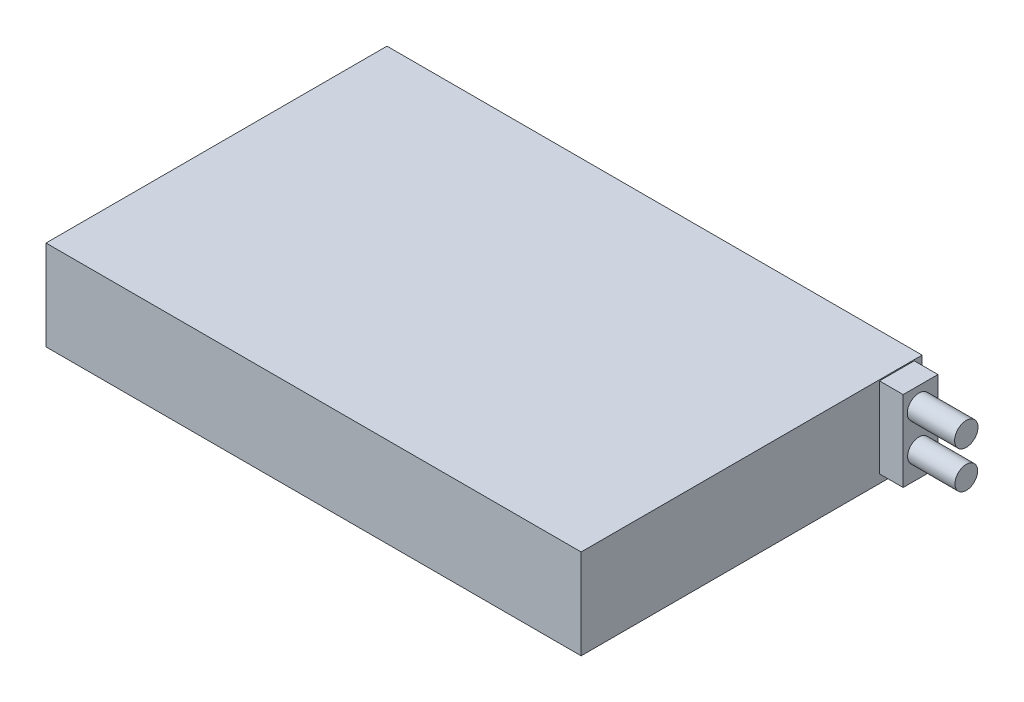
ISO-10303-21;
HEADER;
FILE_DESCRIPTION(('STEP AP214'),'2;1');
FILE_NAME('part.step','',(''),(''),'','','');
FILE_SCHEMA(('AUTOMOTIVE_DESIGN { 1 0 10303 214 1 1 1 1 }'));
ENDSEC;
DATA;
#1=APPLICATION_CONTEXT('core data for automotive mechanical design processes');
#2=APPLICATION_PROTOCOL_DEFINITION('international standard','automotive_design',2000,#1);
#3=PRODUCT_CONTEXT('',#1,'mechanical');
#4=PRODUCT('Part','Part','',(#3));
#5=PRODUCT_RELATED_PRODUCT_CATEGORY('part','',(#4));
#6=PRODUCT_DEFINITION_FORMATION('','',#4);
#7=PRODUCT_DEFINITION_CONTEXT('part definition',#1,'design');
#8=PRODUCT_DEFINITION('design','',#6,#7);
#9=PRODUCT_DEFINITION_SHAPE('','',#8);
#10=(LENGTH_UNIT() NAMED_UNIT(*) SI_UNIT(.MILLI.,.METRE.));
#11=(NAMED_UNIT(*) PLANE_ANGLE_UNIT() SI_UNIT($,.RADIAN.));
#12=(NAMED_UNIT(*) SI_UNIT($,.STERADIAN.) SOLID_ANGLE_UNIT());
#13=UNCERTAINTY_MEASURE_WITH_UNIT(LENGTH_MEASURE(1.E-05),#10,'distance_accuracy_value','');
#14=(GEOMETRIC_REPRESENTATION_CONTEXT(3) GLOBAL_UNCERTAINTY_ASSIGNED_CONTEXT((#13)) GLOBAL_UNIT_ASSIGNED_CONTEXT((#10,
#11,#12)) REPRESENTATION_CONTEXT('',''));
#15=CARTESIAN_POINT('',(0.,0.,0.));
#16=DIRECTION('',(0.,0.,1.));
#17=DIRECTION('',(1.,0.,0.));
#18=AXIS2_PLACEMENT_3D('',#15,#16,#17);
#19=CARTESIAN_POINT('',(113.,19.,0.));
#20=DIRECTION('',(-1.,0.,0.));
#21=DIRECTION('',(0.,0.,1.));
#22=AXIS2_PLACEMENT_3D('',#19,#20,#21);
#23=PLANE('',#22);
#24=DIRECTION('',(0.,0.,-1.));
#25=VECTOR('',#24,1.);
#26=CARTESIAN_POINT('',(113.,0.,0.));
#27=LINE('',#26,#25);
#28=CARTESIAN_POINT('',(113.,0.,72.));
#29=VERTEX_POINT('',#28);
#30=CARTESIAN_POINT('',(113.,0.,0.));
#31=VERTEX_POINT('',#30);
#32=EDGE_CURVE('E144',#29,#31,#27,.T.);
#33=ORIENTED_EDGE('',*,*,#32,.T.);
#34=DIRECTION('',(0.,-1.,0.));
#35=VECTOR('',#34,1.);
#36=CARTESIAN_POINT('',(113.,19.,0.));
#37=LINE('',#36,#35);
#38=CARTESIAN_POINT('',(113.,19.,0.));
#39=VERTEX_POINT('',#38);
#40=EDGE_CURVE('E149',#39,#31,#37,.T.);
#41=ORIENTED_EDGE('',*,*,#40,.F.);
#42=DIRECTION('',(0.,0.,-1.));
#43=VECTOR('',#42,1.);
#44=CARTESIAN_POINT('',(113.,19.,0.));
#45=LINE('',#44,#43);
#46=CARTESIAN_POINT('',(113.,19.,72.));
#47=VERTEX_POINT('',#46);
#48=EDGE_CURVE('E138',#47,#39,#45,.T.);
#49=ORIENTED_EDGE('',*,*,#48,.F.);
#50=DIRECTION('',(0.,-1.,0.));
#51=VECTOR('',#50,1.);
#52=CARTESIAN_POINT('',(113.,19.,72.));
#53=LINE('',#52,#51);
#54=EDGE_CURVE('E45',#47,#29,#53,.T.);
#55=ORIENTED_EDGE('',*,*,#54,.T.);
#56=EDGE_LOOP('',(#33,#41,#49,#55));
#57=FACE_BOUND('',#56,.T.);
#58=DIRECTION('',(0.,-1.,0.));
#59=VECTOR('',#58,1.);
#60=CARTESIAN_POINT('',(113.,18.782490109194,9.00176461725578));
#61=LINE('',#60,#59);
#62=CARTESIAN_POINT('',(113.,18.782490109194,9.00176461725578));
#63=VERTEX_POINT('',#62);
#64=CARTESIAN_POINT('',(113.,1.78058267767386,9.00176461725578));
#65=VERTEX_POINT('',#64);
#66=EDGE_CURVE('E122',#63,#65,#61,.T.);
#67=ORIENTED_EDGE('',*,*,#66,.F.);
#68=DIRECTION('',(0.,0.,1.));
#69=VECTOR('',#68,1.);
#70=CARTESIAN_POINT('',(113.,18.782490109194,9.00176461725578));
#71=LINE('',#70,#69);
#72=CARTESIAN_POINT('',(113.,18.782490109194,1.65774543085948));
#73=VERTEX_POINT('',#72);
#74=EDGE_CURVE('E119',#73,#63,#71,.T.);
#75=ORIENTED_EDGE('',*,*,#74,.F.);
#76=DIRECTION('',(0.,1.,0.));
#77=VECTOR('',#76,1.);
#78=CARTESIAN_POINT('',(113.,18.782490109194,1.65774543085948));
#79=LINE('',#78,#77);
#80=CARTESIAN_POINT('',(113.,1.78058267767386,1.65774543085948));
#81=VERTEX_POINT('',#80);
#82=EDGE_CURVE('E57',#81,#73,#79,.T.);
#83=ORIENTED_EDGE('',*,*,#82,.F.);
#84=DIRECTION('',(0.,0.,-1.));
#85=VECTOR('',#84,1.);
#86=CARTESIAN_POINT('',(113.,1.78058267767386,9.00176461725578));
#87=LINE('',#86,#85);
#88=EDGE_CURVE('E52',#65,#81,#87,.T.);
#89=ORIENTED_EDGE('',*,*,#88,.F.);
#90=EDGE_LOOP('',(#67,#75,#83,#89));
#91=FACE_BOUND('',#90,.T.);
#92=ADVANCED_FACE('F37',(#57,#91),#23,.F.);
#93=CARTESIAN_POINT('',(0.,19.,0.));
#94=DIRECTION('',(1.,0.,0.));
#95=DIRECTION('',(0.,0.,-1.));
#96=AXIS2_PLACEMENT_3D('',#93,#94,#95);
#97=PLANE('',#96);
#98=DIRECTION('',(0.,0.,1.));
#99=VECTOR('',#98,1.);
#100=CARTESIAN_POINT('',(0.,0.,0.));
#101=LINE('',#100,#99);
#102=CARTESIAN_POINT('',(0.,0.,0.));
#103=VERTEX_POINT('',#102);
#104=CARTESIAN_POINT('',(0.,0.,72.));
#105=VERTEX_POINT('',#104);
#106=EDGE_CURVE('E123',#103,#105,#101,.T.);
#107=ORIENTED_EDGE('',*,*,#106,.T.);
#108=DIRECTION('',(0.,-1.,0.));
#109=VECTOR('',#108,1.);
#110=CARTESIAN_POINT('',(0.,19.,72.));
#111=LINE('',#110,#109);
#112=CARTESIAN_POINT('',(0.,19.,72.));
#113=VERTEX_POINT('',#112);
#114=EDGE_CURVE('E11',#113,#105,#111,.T.);
#115=ORIENTED_EDGE('',*,*,#114,.F.);
#116=DIRECTION('',(0.,0.,1.));
#117=VECTOR('',#116,1.);
#118=CARTESIAN_POINT('',(0.,19.,0.));
#119=LINE('',#118,#117);
#120=CARTESIAN_POINT('',(0.,19.,0.));
#121=VERTEX_POINT('',#120);
#122=EDGE_CURVE('E132',#121,#113,#119,.T.);
#123=ORIENTED_EDGE('',*,*,#122,.F.);
#124=DIRECTION('',(0.,-1.,0.));
#125=VECTOR('',#124,1.);
#126=CARTESIAN_POINT('',(0.,19.,0.));
#127=LINE('',#126,#125);
#128=EDGE_CURVE('E141',#121,#103,#127,.T.);
#129=ORIENTED_EDGE('',*,*,#128,.T.);
#130=EDGE_LOOP('',(#107,#115,#123,#129));
#131=FACE_BOUND('',#130,.T.);
#132=ADVANCED_FACE('F39',(#131),#97,.F.);
#133=CARTESIAN_POINT('',(0.,19.,72.));
#134=DIRECTION('',(0.,0.,-1.));
#135=DIRECTION('',(-1.,0.,0.));
#136=AXIS2_PLACEMENT_3D('',#133,#134,#135);
#137=PLANE('',#136);
#138=DIRECTION('',(1.,0.,0.));
#139=VECTOR('',#138,1.);
#140=CARTESIAN_POINT('',(0.,0.,72.));
#141=LINE('',#140,#139);
#142=EDGE_CURVE('E126',#105,#29,#141,.T.);
#143=ORIENTED_EDGE('',*,*,#142,.T.);
#144=ORIENTED_EDGE('',*,*,#54,.F.);
#145=DIRECTION('',(1.,0.,0.));
#146=VECTOR('',#145,1.);
#147=CARTESIAN_POINT('',(0.,19.,72.));
#148=LINE('',#147,#146);
#149=EDGE_CURVE('E135',#113,#47,#148,.T.);
#150=ORIENTED_EDGE('',*,*,#149,.F.);
#151=ORIENTED_EDGE('',*,*,#114,.T.);
#152=EDGE_LOOP('',(#143,#144,#150,#151));
#153=FACE_BOUND('',#152,.T.);
#154=ADVANCED_FACE('F171',(#153),#137,.F.);
#155=CARTESIAN_POINT('',(0.,19.,0.));
#156=DIRECTION('',(0.,0.,1.));
#157=DIRECTION('',(1.,0.,0.));
#158=AXIS2_PLACEMENT_3D('',#155,#156,#157);
#159=PLANE('',#158);
#160=DIRECTION('',(-1.,0.,0.));
#161=VECTOR('',#160,1.);
#162=CARTESIAN_POINT('',(0.,0.,0.));
#163=LINE('',#162,#161);
#164=EDGE_CURVE('E136',#31,#103,#163,.T.);
#165=ORIENTED_EDGE('',*,*,#164,.T.);
#166=ORIENTED_EDGE('',*,*,#128,.F.);
#167=DIRECTION('',(-1.,0.,0.));
#168=VECTOR('',#167,1.);
#169=CARTESIAN_POINT('',(0.,19.,0.));
#170=LINE('',#169,#168);
#171=EDGE_CURVE('E140',#39,#121,#170,.T.);
#172=ORIENTED_EDGE('',*,*,#171,.F.);
#173=ORIENTED_EDGE('',*,*,#40,.T.);
#174=EDGE_LOOP('',(#165,#166,#172,#173));
#175=FACE_BOUND('',#174,.T.);
#176=ADVANCED_FACE('F164',(#175),#159,.F.);
#177=CARTESIAN_POINT('',(0.,19.,0.));
#178=DIRECTION('',(0.,1.,0.));
#179=DIRECTION('',(0.,0.,1.));
#180=AXIS2_PLACEMENT_3D('',#177,#178,#179);
#181=PLANE('',#180);
#182=ORIENTED_EDGE('',*,*,#122,.T.);
#183=ORIENTED_EDGE('',*,*,#149,.T.);
#184=ORIENTED_EDGE('',*,*,#48,.T.);
#185=ORIENTED_EDGE('',*,*,#171,.T.);
#186=EDGE_LOOP('',(#182,#183,#184,#185));
#187=FACE_BOUND('',#186,.T.);
#188=ADVANCED_FACE('F170',(#187),#181,.T.);
#189=CARTESIAN_POINT('',(0.,0.,0.));
#190=DIRECTION('',(0.,1.,0.));
#191=DIRECTION('',(0.,0.,1.));
#192=AXIS2_PLACEMENT_3D('',#189,#190,#191);
#193=PLANE('',#192);
#194=ORIENTED_EDGE('',*,*,#106,.F.);
#195=ORIENTED_EDGE('',*,*,#164,.F.);
#196=ORIENTED_EDGE('',*,*,#32,.F.);
#197=ORIENTED_EDGE('',*,*,#142,.F.);
#198=EDGE_LOOP('',(#194,#195,#196,#197));
#199=FACE_BOUND('',#198,.T.);
#200=ADVANCED_FACE('F161',(#199),#193,.F.);
#201=CARTESIAN_POINT('',(118.,18.782490109194,9.00176461725577));
#202=DIRECTION('',(0.,0.,-1.));
#203=DIRECTION('',(-1.,0.,0.));
#204=AXIS2_PLACEMENT_3D('',#201,#202,#203);
#205=PLANE('',#204);
#206=ORIENTED_EDGE('',*,*,#66,.T.);
#207=DIRECTION('',(-1.,0.,0.));
#208=VECTOR('',#207,1.);
#209=CARTESIAN_POINT('',(118.,1.78058267767386,9.00176461725577));
#210=LINE('',#209,#208);
#211=CARTESIAN_POINT('',(118.,1.78058267767386,9.00176461725577));
#212=VERTEX_POINT('',#211);
#213=EDGE_CURVE('E103',#212,#65,#210,.T.);
#214=ORIENTED_EDGE('',*,*,#213,.F.);
#215=DIRECTION('',(0.,-1.,0.));
#216=VECTOR('',#215,1.);
#217=CARTESIAN_POINT('',(118.,18.782490109194,9.00176461725577));
#218=LINE('',#217,#216);
#219=CARTESIAN_POINT('',(118.,18.782490109194,9.00176461725577));
#220=VERTEX_POINT('',#219);
#221=EDGE_CURVE('E110',#220,#212,#218,.T.);
#222=ORIENTED_EDGE('',*,*,#221,.F.);
#223=DIRECTION('',(-1.,0.,0.));
#224=VECTOR('',#223,1.);
#225=CARTESIAN_POINT('',(118.,18.782490109194,9.00176461725577));
#226=LINE('',#225,#224);
#227=EDGE_CURVE('E235',#220,#63,#226,.T.);
#228=ORIENTED_EDGE('',*,*,#227,.T.);
#229=EDGE_LOOP('',(#206,#214,#222,#228));
#230=FACE_BOUND('',#229,.T.);
#231=ADVANCED_FACE('F121',(#230),#205,.F.);
#232=CARTESIAN_POINT('',(118.,1.78058267767386,9.00176461725577));
#233=DIRECTION('',(0.,1.,0.));
#234=DIRECTION('',(0.,0.,1.));
#235=AXIS2_PLACEMENT_3D('',#232,#233,#234);
#236=PLANE('',#235);
#237=ORIENTED_EDGE('',*,*,#88,.T.);
#238=DIRECTION('',(-1.,0.,0.));
#239=VECTOR('',#238,1.);
#240=CARTESIAN_POINT('',(118.,1.78058267767386,1.65774543085948));
#241=LINE('',#240,#239);
#242=CARTESIAN_POINT('',(118.,1.78058267767386,1.65774543085948));
#243=VERTEX_POINT('',#242);
#244=EDGE_CURVE('E106',#243,#81,#241,.T.);
#245=ORIENTED_EDGE('',*,*,#244,.F.);
#246=DIRECTION('',(0.,0.,-1.));
#247=VECTOR('',#246,1.);
#248=CARTESIAN_POINT('',(118.,1.78058267767386,9.00176461725577));
#249=LINE('',#248,#247);
#250=EDGE_CURVE('E99',#212,#243,#249,.T.);
#251=ORIENTED_EDGE('',*,*,#250,.F.);
#252=ORIENTED_EDGE('',*,*,#213,.T.);
#253=EDGE_LOOP('',(#237,#245,#251,#252));
#254=FACE_BOUND('',#253,.T.);
#255=ADVANCED_FACE('F101',(#254),#236,.F.);
#256=CARTESIAN_POINT('',(118.,18.782490109194,1.65774543085948));
#257=DIRECTION('',(0.,0.,1.));
#258=DIRECTION('',(1.,0.,0.));
#259=AXIS2_PLACEMENT_3D('',#256,#257,#258);
#260=PLANE('',#259);
#261=ORIENTED_EDGE('',*,*,#82,.T.);
#262=DIRECTION('',(-1.,0.,0.));
#263=VECTOR('',#262,1.);
#264=CARTESIAN_POINT('',(118.,18.782490109194,1.65774543085948));
#265=LINE('',#264,#263);
#266=CARTESIAN_POINT('',(118.,18.782490109194,1.65774543085948));
#267=VERTEX_POINT('',#266);
#268=EDGE_CURVE('E128',#267,#73,#265,.T.);
#269=ORIENTED_EDGE('',*,*,#268,.F.);
#270=DIRECTION('',(0.,1.,0.));
#271=VECTOR('',#270,1.);
#272=CARTESIAN_POINT('',(118.,18.782490109194,1.65774543085948));
#273=LINE('',#272,#271);
#274=EDGE_CURVE('E109',#243,#267,#273,.T.);
#275=ORIENTED_EDGE('',*,*,#274,.F.);
#276=ORIENTED_EDGE('',*,*,#244,.T.);
#277=EDGE_LOOP('',(#261,#269,#275,#276));
#278=FACE_BOUND('',#277,.T.);
#279=ADVANCED_FACE('F191',(#278),#260,.F.);
#280=CARTESIAN_POINT('',(118.,18.782490109194,9.00176461725577));
#281=DIRECTION('',(0.,-1.,0.));
#282=DIRECTION('',(0.,0.,-1.));
#283=AXIS2_PLACEMENT_3D('',#280,#281,#282);
#284=PLANE('',#283);
#285=ORIENTED_EDGE('',*,*,#74,.T.);
#286=ORIENTED_EDGE('',*,*,#227,.F.);
#287=DIRECTION('',(0.,0.,1.));
#288=VECTOR('',#287,1.);
#289=CARTESIAN_POINT('',(118.,18.782490109194,9.00176461725577));
#290=LINE('',#289,#288);
#291=EDGE_CURVE('E115',#267,#220,#290,.T.);
#292=ORIENTED_EDGE('',*,*,#291,.F.);
#293=ORIENTED_EDGE('',*,*,#268,.T.);
#294=EDGE_LOOP('',(#285,#286,#292,#293));
#295=FACE_BOUND('',#294,.T.);
#296=ADVANCED_FACE('F194',(#295),#284,.F.);
#297=CARTESIAN_POINT('',(118.,0.,0.));
#298=DIRECTION('',(1.,0.,0.));
#299=DIRECTION('',(0.,0.,-1.));
#300=AXIS2_PLACEMENT_3D('',#297,#298,#299);
#301=PLANE('',#300);
#302=CARTESIAN_POINT('',(118.,6.97812381239343,5.67234168473715));
#303=DIRECTION('',(1.,0.,0.));
#304=DIRECTION('',(0.,0.,-1.));
#305=AXIS2_PLACEMENT_3D('',#302,#303,#304);
#306=CIRCLE('',#305,2.39572166224697);
#307=CARTESIAN_POINT('',(118.,6.97812381239343,3.27662002249018));
#308=VERTEX_POINT('',#307);
#309=EDGE_CURVE('E223',#308,#308,#306,.T.);
#310=ORIENTED_EDGE('',*,*,#309,.F.);
#311=EDGE_LOOP('',(#310));
#312=FACE_BOUND('',#311,.T.);
#313=CARTESIAN_POINT('',(118.,14.9275638734857,5.67234168473715));
#314=DIRECTION('',(1.,0.,0.));
#315=DIRECTION('',(0.,0.,-1.));
#316=AXIS2_PLACEMENT_3D('',#313,#314,#315);
#317=CIRCLE('',#316,2.47185322382079);
#318=CARTESIAN_POINT('',(118.,14.9275638734857,3.20048846091636));
#319=VERTEX_POINT('',#318);
#320=EDGE_CURVE('E222',#319,#319,#317,.T.);
#321=ORIENTED_EDGE('',*,*,#320,.F.);
#322=EDGE_LOOP('',(#321));
#323=FACE_BOUND('',#322,.T.);
#324=ORIENTED_EDGE('',*,*,#221,.T.);
#325=ORIENTED_EDGE('',*,*,#250,.T.);
#326=ORIENTED_EDGE('',*,*,#274,.T.);
#327=ORIENTED_EDGE('',*,*,#291,.T.);
#328=EDGE_LOOP('',(#324,#325,#326,#327));
#329=FACE_BOUND('',#328,.T.);
#330=ADVANCED_FACE('F113',(#312,#323,#329),#301,.T.);
#331=CARTESIAN_POINT('',(128.,14.9275638734857,5.67234168473715));
#332=DIRECTION('',(-1.,0.,0.));
#333=DIRECTION('',(0.,0.,1.));
#334=AXIS2_PLACEMENT_3D('',#331,#332,#333);
#335=CYLINDRICAL_SURFACE('',#334,2.47185322382079);
#336=CARTESIAN_POINT('',(128.,14.9275638734857,5.67234168473715));
#337=DIRECTION('',(1.,0.,0.));
#338=DIRECTION('',(0.,0.,-1.));
#339=AXIS2_PLACEMENT_3D('',#336,#337,#338);
#340=CIRCLE('',#339,2.47185322382079);
#341=CARTESIAN_POINT('',(128.,14.9275638734857,3.20048846091636));
#342=VERTEX_POINT('',#341);
#343=EDGE_CURVE('E226',#342,#342,#340,.T.);
#344=ORIENTED_EDGE('',*,*,#343,.F.);
#345=EDGE_LOOP('',(#344));
#346=FACE_BOUND('',#345,.T.);
#347=ORIENTED_EDGE('',*,*,#320,.T.);
#348=EDGE_LOOP('',(#347));
#349=FACE_BOUND('',#348,.T.);
#350=ADVANCED_FACE('F201',(#346,#349),#335,.T.);
#351=CARTESIAN_POINT('',(128.,14.9275638734857,5.67234168473715));
#352=DIRECTION('',(1.,0.,0.));
#353=DIRECTION('',(0.,0.,-1.));
#354=AXIS2_PLACEMENT_3D('',#351,#352,#353);
#355=PLANE('',#354);
#356=ORIENTED_EDGE('',*,*,#343,.T.);
#357=EDGE_LOOP('',(#356));
#358=FACE_BOUND('',#357,.T.);
#359=ADVANCED_FACE('F205',(#358),#355,.T.);
#360=CARTESIAN_POINT('',(128.,6.97812381239343,5.67234168473715));
#361=DIRECTION('',(-1.,0.,0.));
#362=DIRECTION('',(0.,0.,1.));
#363=AXIS2_PLACEMENT_3D('',#360,#361,#362);
#364=CYLINDRICAL_SURFACE('',#363,2.39572166224697);
#365=CARTESIAN_POINT('',(128.,6.97812381239343,5.67234168473715));
#366=DIRECTION('',(1.,0.,0.));
#367=DIRECTION('',(0.,0.,-1.));
#368=AXIS2_PLACEMENT_3D('',#365,#366,#367);
#369=CIRCLE('',#368,2.39572166224697);
#370=CARTESIAN_POINT('',(128.,6.97812381239343,3.27662002249018));
#371=VERTEX_POINT('',#370);
#372=EDGE_CURVE('E221',#371,#371,#369,.T.);
#373=ORIENTED_EDGE('',*,*,#372,.F.);
#374=EDGE_LOOP('',(#373));
#375=FACE_BOUND('',#374,.T.);
#376=ORIENTED_EDGE('',*,*,#309,.T.);
#377=EDGE_LOOP('',(#376));
#378=FACE_BOUND('',#377,.T.);
#379=ADVANCED_FACE('F209',(#375,#378),#364,.T.);
#380=CARTESIAN_POINT('',(128.,6.97812381239343,5.67234168473715));
#381=DIRECTION('',(1.,0.,0.));
#382=DIRECTION('',(0.,0.,-1.));
#383=AXIS2_PLACEMENT_3D('',#380,#381,#382);
#384=PLANE('',#383);
#385=ORIENTED_EDGE('',*,*,#372,.T.);
#386=EDGE_LOOP('',(#385));
#387=FACE_BOUND('',#386,.T.);
#388=ADVANCED_FACE('F213',(#387),#384,.T.);
#389=CLOSED_SHELL('',(#92,#132,#154,#176,#188,#200,#231,#255,#279,#296,#330,#350,#359,#379,#388));
#390=MANIFOLD_SOLID_BREP('B2',#389);
#391=ADVANCED_BREP_SHAPE_REPRESENTATION('',(#18,#390),#14);
#392=SHAPE_DEFINITION_REPRESENTATION(#9,#391);
ENDSEC;
END-ISO-10303-21;
